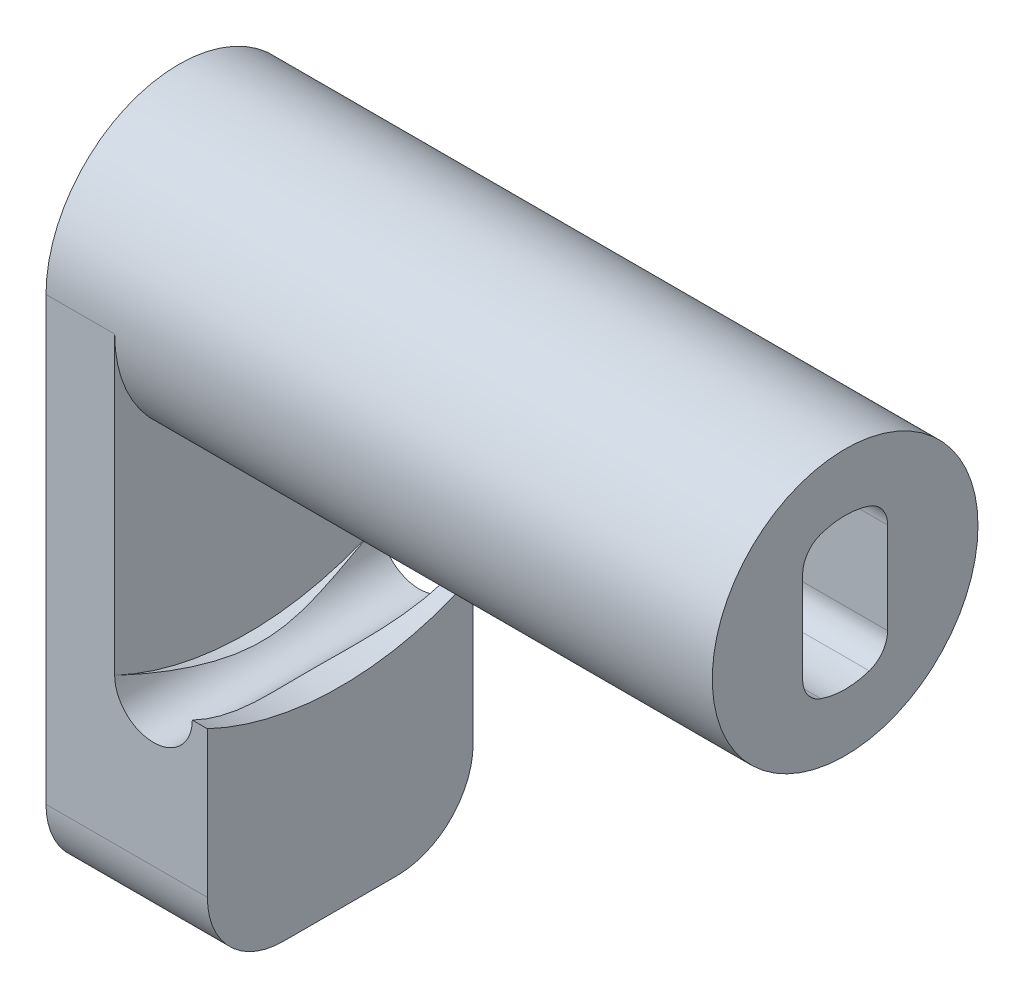
ISO-10303-21;
HEADER;
FILE_DESCRIPTION(('STEP AP214'),'2;1');
FILE_NAME('part.step','',(''),(''),'','','');
FILE_SCHEMA(('AUTOMOTIVE_DESIGN { 1 0 10303 214 1 1 1 1 }'));
ENDSEC;
DATA;
#1=APPLICATION_CONTEXT('core data for automotive mechanical design processes');
#2=APPLICATION_PROTOCOL_DEFINITION('international standard','automotive_design',2000,#1);
#3=PRODUCT_CONTEXT('',#1,'mechanical');
#4=PRODUCT('Part','Part','',(#3));
#5=PRODUCT_RELATED_PRODUCT_CATEGORY('part','',(#4));
#6=PRODUCT_DEFINITION_FORMATION('','',#4);
#7=PRODUCT_DEFINITION_CONTEXT('part definition',#1,'design');
#8=PRODUCT_DEFINITION('design','',#6,#7);
#9=PRODUCT_DEFINITION_SHAPE('','',#8);
#10=(LENGTH_UNIT() NAMED_UNIT(*) SI_UNIT(.MILLI.,.METRE.));
#11=(NAMED_UNIT(*) PLANE_ANGLE_UNIT() SI_UNIT($,.RADIAN.));
#12=(NAMED_UNIT(*) SI_UNIT($,.STERADIAN.) SOLID_ANGLE_UNIT());
#13=UNCERTAINTY_MEASURE_WITH_UNIT(LENGTH_MEASURE(1.E-05),#10,'distance_accuracy_value','');
#14=(GEOMETRIC_REPRESENTATION_CONTEXT(3) GLOBAL_UNCERTAINTY_ASSIGNED_CONTEXT((#13)) GLOBAL_UNIT_ASSIGNED_CONTEXT((#10,
#11,#12)) REPRESENTATION_CONTEXT('',''));
#15=CARTESIAN_POINT('',(0.,0.,0.));
#16=DIRECTION('',(0.,0.,1.));
#17=DIRECTION('',(1.,0.,0.));
#18=AXIS2_PLACEMENT_3D('',#15,#16,#17);
#19=CARTESIAN_POINT('',(-13.1529612058234,-1.08551700717587,0.));
#20=DIRECTION('',(1.,0.,0.));
#21=DIRECTION('',(0.,0.,-1.));
#22=AXIS2_PLACEMENT_3D('',#19,#20,#21);
#23=CYLINDRICAL_SURFACE('',#22,20.32);
#24=CARTESIAN_POINT('',(4.516000112,-19.431,-8.7376));
#25=CARTESIAN_POINT('',(4.51603731749877,-19.5177287528389,-8.5555150718596));
#26=CARTESIAN_POINT('',(4.52041756207572,-19.6017131843481,-8.37218776939642));
#27=CARTESIAN_POINT('',(4.53649669182362,-19.7640441249381,-8.00346974642191));
#28=CARTESIAN_POINT('',(4.54819196914922,-19.8423933921093,-7.81808008733202));
#29=CARTESIAN_POINT('',(4.57750524371221,-19.9932298337656,-7.44587482763609));
#30=CARTESIAN_POINT('',(4.59511059020355,-20.0657291226541,-7.25906309881219));
#31=CARTESIAN_POINT('',(4.6350984527638,-20.2050234726588,-6.88381652494582));
#32=CARTESIAN_POINT('',(4.65748161048571,-20.2718177659139,-6.69538146515752));
#33=CARTESIAN_POINT('',(4.73063386302325,-20.4648184988648,-6.12434180645761));
#34=CARTESIAN_POINT('',(4.78709294470231,-20.5822383370678,-5.73947026967527));
#35=CARTESIAN_POINT('',(4.90685418840569,-20.7938885012978,-4.9642812598655));
#36=CARTESIAN_POINT('',(4.97016061356254,-20.8881042595447,-4.57396052741235));
#37=CARTESIAN_POINT('',(5.09296430268536,-21.0504853530193,-3.80167743454365));
#38=CARTESIAN_POINT('',(5.15251770203577,-21.1194348094891,-3.41988894288582));
#39=CARTESIAN_POINT('',(5.26139557184988,-21.235522973599,-2.65150880361196));
#40=CARTESIAN_POINT('',(5.31072214253996,-21.2826661619228,-2.26491815950602));
#41=CARTESIAN_POINT('',(5.36996981115032,-21.3365954064752,-1.68338288453226));
#42=CARTESIAN_POINT('',(5.38722709898677,-21.3517501970454,-1.48994178039054));
#43=CARTESIAN_POINT('',(5.41595618999079,-21.376527934953,-1.10226762126502));
#44=CARTESIAN_POINT('',(5.42742814364184,-21.3861510261775,-0.908034587012759));
#45=CARTESIAN_POINT('',(5.44384213927347,-21.399814361787,-0.519182820192744));
#46=CARTESIAN_POINT('',(5.4487872492382,-21.4038572292324,-0.324564311936539));
#47=CARTESIAN_POINT('',(5.45182482094318,-21.4063463641171,0.0647645243224691));
#48=CARTESIAN_POINT('',(5.44991713093645,-21.4047925076236,0.25947485426309));
#49=CARTESIAN_POINT('',(5.43791560220297,-21.3949008098425,0.702031122744907));
#50=CARTESIAN_POINT('',(5.42571740508307,-21.3848170128464,0.949783737628716));
#51=CARTESIAN_POINT('',(5.39165308592273,-21.3556506908518,1.44409389752363));
#52=CARTESIAN_POINT('',(5.36978570537389,-21.3365669944351,1.69065128274307));
#53=CARTESIAN_POINT('',(5.31841361275851,-21.2894896279478,2.1824283587983));
#54=CARTESIAN_POINT('',(5.28889873312364,-21.2614840845627,2.42764582157201));
#55=CARTESIAN_POINT('',(5.22459428249614,-21.1966813330368,2.91619580195046));
#56=CARTESIAN_POINT('',(5.18980480135659,-21.1598842746537,3.15952835159059));
#57=CARTESIAN_POINT('',(5.11704832924566,-21.0773221209748,3.64572203666351));
#58=CARTESIAN_POINT('',(5.0790635160548,-21.03150451255,3.88857157186214));
#59=CARTESIAN_POINT('',(5.00229123413209,-20.931076768087,4.37232221506012));
#60=CARTESIAN_POINT('',(4.96350366591518,-20.876465536504,4.61322307635335));
#61=CARTESIAN_POINT('',(4.84906519895848,-20.6995446264881,5.332540827966));
#62=CARTESIAN_POINT('',(4.77524179271125,-20.5640491428703,5.80815334623814));
#63=CARTESIAN_POINT('',(4.68332294902369,-20.3429656895821,6.48856420455001));
#64=CARTESIAN_POINT('',(4.6570609963979,-20.2715032996002,6.69693796652465));
#65=CARTESIAN_POINT('',(4.60994604418476,-20.1216333367819,7.1117720077411));
#66=CARTESIAN_POINT('',(4.58909206679276,-20.0432270229058,7.31823262637574));
#67=CARTESIAN_POINT('',(4.55437450524215,-19.8797799982117,7.72829969041081));
#68=CARTESIAN_POINT('',(4.5404869822015,-19.7947631829191,7.93191353995666));
#69=CARTESIAN_POINT('',(4.52609874323223,-19.6621542658722,8.23548148381315));
#70=CARTESIAN_POINT('',(4.52237634337057,-19.617088565154,8.33639443081653));
#71=CARTESIAN_POINT('',(4.51732854253573,-19.525288679427,8.53753160177582));
#72=CARTESIAN_POINT('',(4.51600340983757,-19.4785543082763,8.63775574739877));
#73=CARTESIAN_POINT('',(4.516000112,-19.431,8.7376));
#74=B_SPLINE_CURVE_WITH_KNOTS('',3,(#24,#25,#26,#27,#28,#29,#30,#31,#32,#33,#34,#35,#36,#37,#38,
#39,#40,#41,#42,#43,#44,#45,#46,#47,#48,#49,#50,#51,#52,#53,#54,#55,#56,#57,#58,#59,#60,#61,#62,
#63,#64,#65,#66,#67,#68,#69,#70,#71,#72,#73),.UNSPECIFIED.,.F.,.F.,(4,2,2,2,2,2,2,2,2,2,2,2,2,2,
2,2,2,2,2,2,2,2,2,2,4),(0.,0.604902094843688,1.20950608108938,1.81282405341211,2.41622310148412,
3.6342575228127,4.8530547015255,6.02995777472376,7.20661891401831,7.79087980929366,
8.37512550645878,8.95909647731702,9.54308037958888,10.2874501190093,11.0319167716234,
11.7773783385945,12.522827208021,13.2727513586984,14.0227690103302,15.5210179611022,
16.1864245199329,16.8517106839849,17.5146947852316,17.8464021322582,18.1781465979217),.UNSPECIFIED.);
#75=CARTESIAN_POINT('',(4.516000112,-19.431,-8.7376));
#76=VERTEX_POINT('',#75);
#77=CARTESIAN_POINT('',(4.516000112,-19.431,8.7376));
#78=VERTEX_POINT('',#77);
#79=EDGE_CURVE('E225',#76,#78,#74,.T.);
#80=ORIENTED_EDGE('',*,*,#79,.F.);
#81=CARTESIAN_POINT('',(4.516000112,-1.08551700717587,0.));
#82=DIRECTION('',(-1.,0.,0.));
#83=DIRECTION('',(0.,0.,1.));
#84=AXIS2_PLACEMENT_3D('',#81,#82,#83);
#85=CIRCLE('',#84,20.32);
#86=EDGE_CURVE('E243',#76,#78,#85,.T.);
#87=ORIENTED_EDGE('',*,*,#86,.T.);
#88=EDGE_LOOP('',(#80,#87));
#89=FACE_BOUND('',#88,.T.);
#90=ADVANCED_FACE('F46',(#89),#23,.F.);
#91=CARTESIAN_POINT('',(43.815,0.,0.));
#92=DIRECTION('',(-1.,0.,0.));
#93=DIRECTION('',(0.,0.,1.));
#94=AXIS2_PLACEMENT_3D('',#91,#92,#93);
#95=CYLINDRICAL_SURFACE('',#94,8.7376);
#96=CARTESIAN_POINT('',(4.516000112,0.,0.));
#97=DIRECTION('',(-1.,0.,0.));
#98=DIRECTION('',(0.,0.,1.));
#99=AXIS2_PLACEMENT_3D('',#96,#97,#98);
#100=CIRCLE('',#99,8.7376);
#101=CARTESIAN_POINT('',(4.516000112,0.,-8.7376));
#102=VERTEX_POINT('',#101);
#103=CARTESIAN_POINT('',(4.516000112,0.,8.7376));
#104=VERTEX_POINT('',#103);
#105=EDGE_CURVE('E266',#102,#104,#100,.T.);
#106=ORIENTED_EDGE('',*,*,#105,.F.);
#107=DIRECTION('',(-1.,0.,0.));
#108=VECTOR('',#107,1.);
#109=CARTESIAN_POINT('',(4.516000112,0.,-8.7376));
#110=LINE('',#109,#108);
#111=CARTESIAN_POINT('',(0.,0.,-8.7376));
#112=VERTEX_POINT('',#111);
#113=EDGE_CURVE('E276',#102,#112,#110,.T.);
#114=ORIENTED_EDGE('',*,*,#113,.T.);
#115=CARTESIAN_POINT('',(0.,0.,0.));
#116=DIRECTION('',(1.,0.,0.));
#117=DIRECTION('',(0.,0.,-1.));
#118=AXIS2_PLACEMENT_3D('',#115,#116,#117);
#119=CIRCLE('',#118,8.7376);
#120=CARTESIAN_POINT('',(0.,0.,8.7376));
#121=VERTEX_POINT('',#120);
#122=EDGE_CURVE('E278',#112,#121,#119,.T.);
#123=ORIENTED_EDGE('',*,*,#122,.T.);
#124=DIRECTION('',(-1.,0.,0.));
#125=VECTOR('',#124,1.);
#126=CARTESIAN_POINT('',(4.516000112,0.,8.7376));
#127=LINE('',#126,#125);
#128=EDGE_CURVE('E267',#104,#121,#127,.T.);
#129=ORIENTED_EDGE('',*,*,#128,.F.);
#130=EDGE_LOOP('',(#106,#114,#123,#129));
#131=FACE_BOUND('',#130,.T.);
#132=CARTESIAN_POINT('',(43.815,0.,0.));
#133=DIRECTION('',(1.,0.,0.));
#134=DIRECTION('',(0.,0.,-1.));
#135=AXIS2_PLACEMENT_3D('',#132,#133,#134);
#136=CIRCLE('',#135,8.7376);
#137=CARTESIAN_POINT('',(43.815,0.,-8.7376));
#138=VERTEX_POINT('',#137);
#139=EDGE_CURVE('E285',#138,#138,#136,.T.);
#140=ORIENTED_EDGE('',*,*,#139,.F.);
#141=EDGE_LOOP('',(#140));
#142=FACE_BOUND('',#141,.T.);
#143=ADVANCED_FACE('F384',(#131,#142),#95,.T.);
#144=CARTESIAN_POINT('',(43.815,0.,0.));
#145=DIRECTION('',(1.,0.,0.));
#146=DIRECTION('',(0.,0.,-1.));
#147=AXIS2_PLACEMENT_3D('',#144,#145,#146);
#148=PLANE('',#147);
#149=CARTESIAN_POINT('',(43.815,0.,0.));
#150=DIRECTION('',(1.,0.,0.));
#151=DIRECTION('',(0.,0.,-1.));
#152=AXIS2_PLACEMENT_3D('',#149,#150,#151);
#153=CIRCLE('',#152,4.953);
#154=CARTESIAN_POINT('',(43.815,4.69255908842926,-1.58496));
#155=VERTEX_POINT('',#154);
#156=CARTESIAN_POINT('',(43.815,4.69255908842926,1.58496));
#157=VERTEX_POINT('',#156);
#158=EDGE_CURVE('E468',#155,#157,#153,.T.);
#159=ORIENTED_EDGE('',*,*,#158,.F.);
#160=CARTESIAN_POINT('',(43.815,3.00805069771106,-1.016));
#161=DIRECTION('',(1.,0.,0.));
#162=DIRECTION('',(0.,0.,-1.));
#163=AXIS2_PLACEMENT_3D('',#160,#161,#162);
#164=CIRCLE('',#163,1.778);
#165=CARTESIAN_POINT('',(43.815,3.00805069771106,-2.794));
#166=VERTEX_POINT('',#165);
#167=EDGE_CURVE('E330',#155,#166,#164,.F.);
#168=ORIENTED_EDGE('',*,*,#167,.T.);
#169=DIRECTION('',(0.,1.,0.));
#170=VECTOR('',#169,1.);
#171=CARTESIAN_POINT('',(43.815,-4.08971551577857,-2.794));
#172=LINE('',#171,#170);
#173=CARTESIAN_POINT('',(43.815,-3.00805069771106,-2.794));
#174=VERTEX_POINT('',#173);
#175=EDGE_CURVE('E474',#174,#166,#172,.T.);
#176=ORIENTED_EDGE('',*,*,#175,.F.);
#177=CARTESIAN_POINT('',(43.815,-3.00805069771106,-1.016));
#178=DIRECTION('',(1.,0.,0.));
#179=DIRECTION('',(0.,0.,-1.));
#180=AXIS2_PLACEMENT_3D('',#177,#178,#179);
#181=CIRCLE('',#180,1.778);
#182=CARTESIAN_POINT('',(43.815,-4.69255908842926,-1.58496));
#183=VERTEX_POINT('',#182);
#184=EDGE_CURVE('E331',#174,#183,#181,.F.);
#185=ORIENTED_EDGE('',*,*,#184,.T.);
#186=CARTESIAN_POINT('',(43.815,0.,0.));
#187=DIRECTION('',(1.,0.,0.));
#188=DIRECTION('',(0.,0.,-1.));
#189=AXIS2_PLACEMENT_3D('',#186,#187,#188);
#190=CIRCLE('',#189,4.953);
#191=CARTESIAN_POINT('',(43.815,-4.69255908842926,1.58496));
#192=VERTEX_POINT('',#191);
#193=EDGE_CURVE('E489',#192,#183,#190,.T.);
#194=ORIENTED_EDGE('',*,*,#193,.F.);
#195=CARTESIAN_POINT('',(43.815,-3.00805069771106,1.016));
#196=DIRECTION('',(1.,0.,0.));
#197=DIRECTION('',(0.,0.,-1.));
#198=AXIS2_PLACEMENT_3D('',#195,#196,#197);
#199=CIRCLE('',#198,1.778);
#200=CARTESIAN_POINT('',(43.815,-3.00805069771106,2.794));
#201=VERTEX_POINT('',#200);
#202=EDGE_CURVE('E223',#192,#201,#199,.F.);
#203=ORIENTED_EDGE('',*,*,#202,.T.);
#204=DIRECTION('',(0.,-1.,0.));
#205=VECTOR('',#204,1.);
#206=CARTESIAN_POINT('',(43.815,-4.08971551577857,2.794));
#207=LINE('',#206,#205);
#208=CARTESIAN_POINT('',(43.815,3.00805069771106,2.794));
#209=VERTEX_POINT('',#208);
#210=EDGE_CURVE('E488',#209,#201,#207,.T.);
#211=ORIENTED_EDGE('',*,*,#210,.F.);
#212=CARTESIAN_POINT('',(43.815,3.00805069771106,1.016));
#213=DIRECTION('',(1.,0.,0.));
#214=DIRECTION('',(0.,0.,-1.));
#215=AXIS2_PLACEMENT_3D('',#212,#213,#214);
#216=CIRCLE('',#215,1.778);
#217=EDGE_CURVE('E333',#209,#157,#216,.F.);
#218=ORIENTED_EDGE('',*,*,#217,.T.);
#219=EDGE_LOOP('',(#159,#168,#176,#185,#194,#203,#211,#218));
#220=FACE_BOUND('',#219,.T.);
#221=ORIENTED_EDGE('',*,*,#139,.T.);
#222=EDGE_LOOP('',(#221));
#223=FACE_BOUND('',#222,.T.);
#224=ADVANCED_FACE('F391',(#220,#223),#148,.T.);
#225=CARTESIAN_POINT('',(0.,0.,0.));
#226=DIRECTION('',(1.,0.,0.));
#227=DIRECTION('',(0.,0.,-1.));
#228=AXIS2_PLACEMENT_3D('',#225,#226,#227);
#229=PLANE('',#228);
#230=CARTESIAN_POINT('',(0.,0.,0.));
#231=DIRECTION('',(-1.,0.,0.));
#232=DIRECTION('',(0.,0.,1.));
#233=AXIS2_PLACEMENT_3D('',#230,#231,#232);
#234=CIRCLE('',#233,4.064);
#235=CARTESIAN_POINT('',(0.,-3.29817815590477,2.37447191011236));
#236=VERTEX_POINT('',#235);
#237=CARTESIAN_POINT('',(0.,-3.29817815590477,-2.37447191011236));
#238=VERTEX_POINT('',#237);
#239=EDGE_CURVE('E463',#236,#238,#234,.T.);
#240=ORIENTED_EDGE('',*,*,#239,.F.);
#241=CARTESIAN_POINT('',(0.,-4.58652899805506,3.302));
#242=DIRECTION('',(1.,0.,0.));
#243=DIRECTION('',(0.,0.,-1.));
#244=AXIS2_PLACEMENT_3D('',#241,#242,#243);
#245=CIRCLE('',#244,1.5875);
#246=CARTESIAN_POINT('',(0.,-4.58652899805506,1.7145));
#247=VERTEX_POINT('',#246);
#248=EDGE_CURVE('E408',#236,#247,#245,.F.);
#249=ORIENTED_EDGE('',*,*,#248,.T.);
#250=DIRECTION('',(0.,1.,0.));
#251=VECTOR('',#250,1.);
#252=CARTESIAN_POINT('',(0.,-3.68464187540662,1.7145));
#253=LINE('',#252,#251);
#254=CARTESIAN_POINT('',(0.,-5.58964187540662,1.7145));
#255=VERTEX_POINT('',#254);
#256=EDGE_CURVE('E437',#255,#247,#253,.T.);
#257=ORIENTED_EDGE('',*,*,#256,.F.);
#258=CARTESIAN_POINT('',(0.,-5.58964187540662,0.127));
#259=DIRECTION('',(1.,0.,0.));
#260=DIRECTION('',(0.,0.,-1.));
#261=AXIS2_PLACEMENT_3D('',#258,#259,#260);
#262=CIRCLE('',#261,1.5875);
#263=CARTESIAN_POINT('',(0.,-7.17714187540662,0.127));
#264=VERTEX_POINT('',#263);
#265=EDGE_CURVE('E427',#255,#264,#262,.T.);
#266=ORIENTED_EDGE('',*,*,#265,.T.);
#267=DIRECTION('',(0.,0.,1.));
#268=VECTOR('',#267,1.);
#269=CARTESIAN_POINT('',(0.,-7.17714187540662,1.7145));
#270=LINE('',#269,#268);
#271=CARTESIAN_POINT('',(0.,-7.17714187540662,-0.127000000000001));
#272=VERTEX_POINT('',#271);
#273=EDGE_CURVE('E436',#272,#264,#270,.T.);
#274=ORIENTED_EDGE('',*,*,#273,.F.);
#275=CARTESIAN_POINT('',(0.,-5.58964187540662,-0.127));
#276=DIRECTION('',(1.,0.,0.));
#277=DIRECTION('',(0.,0.,-1.));
#278=AXIS2_PLACEMENT_3D('',#275,#276,#277);
#279=CIRCLE('',#278,1.5875);
#280=CARTESIAN_POINT('',(0.,-5.58964187540662,-1.7145));
#281=VERTEX_POINT('',#280);
#282=EDGE_CURVE('E12',#272,#281,#279,.T.);
#283=ORIENTED_EDGE('',*,*,#282,.T.);
#284=DIRECTION('',(0.,-1.,0.));
#285=VECTOR('',#284,1.);
#286=CARTESIAN_POINT('',(0.,-3.68464187540662,-1.7145));
#287=LINE('',#286,#285);
#288=CARTESIAN_POINT('',(0.,-4.58652899805507,-1.7145));
#289=VERTEX_POINT('',#288);
#290=EDGE_CURVE('E450',#289,#281,#287,.T.);
#291=ORIENTED_EDGE('',*,*,#290,.F.);
#292=CARTESIAN_POINT('',(0.,-4.58652899805507,-3.302));
#293=DIRECTION('',(1.,0.,0.));
#294=DIRECTION('',(0.,0.,-1.));
#295=AXIS2_PLACEMENT_3D('',#292,#293,#294);
#296=CIRCLE('',#295,1.5875);
#297=EDGE_CURVE('E404',#289,#238,#296,.F.);
#298=ORIENTED_EDGE('',*,*,#297,.T.);
#299=EDGE_LOOP('',(#240,#249,#257,#266,#274,#283,#291,#298));
#300=FACE_BOUND('',#299,.T.);
#301=DIRECTION('',(0.,0.,-1.));
#302=VECTOR('',#301,1.);
#303=CARTESIAN_POINT('',(0.,-34.036,0.));
#304=LINE('',#303,#302);
#305=CARTESIAN_POINT('',(0.,-34.036,3.7376));
#306=VERTEX_POINT('',#305);
#307=CARTESIAN_POINT('',(0.,-34.036,-3.7376));
#308=VERTEX_POINT('',#307);
#309=EDGE_CURVE('E271',#306,#308,#304,.T.);
#310=ORIENTED_EDGE('',*,*,#309,.F.);
#311=CARTESIAN_POINT('',(0.,-29.036,3.7376));
#312=DIRECTION('',(1.,0.,0.));
#313=DIRECTION('',(0.,0.,-1.));
#314=AXIS2_PLACEMENT_3D('',#311,#312,#313);
#315=CIRCLE('',#314,5.);
#316=CARTESIAN_POINT('',(0.,-29.036,8.7376));
#317=VERTEX_POINT('',#316);
#318=EDGE_CURVE('E292',#306,#317,#315,.F.);
#319=ORIENTED_EDGE('',*,*,#318,.T.);
#320=DIRECTION('',(0.,-1.,0.));
#321=VECTOR('',#320,1.);
#322=CARTESIAN_POINT('',(0.,0.,8.7376));
#323=LINE('',#322,#321);
#324=EDGE_CURVE('E261',#121,#317,#323,.T.);
#325=ORIENTED_EDGE('',*,*,#324,.F.);
#326=ORIENTED_EDGE('',*,*,#122,.F.);
#327=DIRECTION('',(0.,1.,0.));
#328=VECTOR('',#327,1.);
#329=CARTESIAN_POINT('',(0.,0.,-8.7376));
#330=LINE('',#329,#328);
#331=CARTESIAN_POINT('',(0.,-29.036,-8.7376));
#332=VERTEX_POINT('',#331);
#333=EDGE_CURVE('E259',#332,#112,#330,.T.);
#334=ORIENTED_EDGE('',*,*,#333,.F.);
#335=CARTESIAN_POINT('',(0.,-29.036,-3.7376));
#336=DIRECTION('',(1.,0.,0.));
#337=DIRECTION('',(0.,0.,-1.));
#338=AXIS2_PLACEMENT_3D('',#335,#336,#337);
#339=CIRCLE('',#338,5.);
#340=EDGE_CURVE('E291',#332,#308,#339,.F.);
#341=ORIENTED_EDGE('',*,*,#340,.T.);
#342=EDGE_LOOP('',(#310,#319,#325,#326,#334,#341));
#343=FACE_BOUND('',#342,.T.);
#344=ADVANCED_FACE('F431',(#300,#343),#229,.F.);
#345=CARTESIAN_POINT('',(4.516000112,0.,-8.7376));
#346=DIRECTION('',(0.,0.,1.));
#347=DIRECTION('',(0.,-1.,0.));
#348=AXIS2_PLACEMENT_3D('',#345,#346,#347);
#349=PLANE('',#348);
#350=DIRECTION('',(0.,1.,0.));
#351=VECTOR('',#350,1.);
#352=CARTESIAN_POINT('',(4.516000112,0.,-8.7376));
#353=LINE('',#352,#351);
#354=EDGE_CURVE('E235',#76,#102,#353,.T.);
#355=ORIENTED_EDGE('',*,*,#354,.F.);
#356=CARTESIAN_POINT('',(7.068700112,-19.431,-8.7376));
#357=DIRECTION('',(0.,0.,-1.));
#358=DIRECTION('',(0.,1.,0.));
#359=AXIS2_PLACEMENT_3D('',#356,#357,#358);
#360=CIRCLE('',#359,2.5527);
#361=CARTESIAN_POINT('',(9.621400112,-19.431,-8.7376));
#362=VERTEX_POINT('',#361);
#363=EDGE_CURVE('E214',#362,#76,#360,.T.);
#364=ORIENTED_EDGE('',*,*,#363,.F.);
#365=DIRECTION('',(1.,0.,0.));
#366=VECTOR('',#365,1.);
#367=CARTESIAN_POINT('',(-13.1529612058234,-19.431,-8.7376));
#368=LINE('',#367,#366);
#369=CARTESIAN_POINT('',(10.612000112,-19.431,-8.7376));
#370=VERTEX_POINT('',#369);
#371=EDGE_CURVE('E230',#362,#370,#368,.T.);
#372=ORIENTED_EDGE('',*,*,#371,.T.);
#373=DIRECTION('',(0.,1.,0.));
#374=VECTOR('',#373,1.);
#375=CARTESIAN_POINT('',(10.612000112,0.,-8.7376));
#376=LINE('',#375,#374);
#377=CARTESIAN_POINT('',(10.612000112,-29.036,-8.7376));
#378=VERTEX_POINT('',#377);
#379=EDGE_CURVE('E256',#378,#370,#376,.T.);
#380=ORIENTED_EDGE('',*,*,#379,.F.);
#381=DIRECTION('',(-1.,0.,0.));
#382=VECTOR('',#381,1.);
#383=CARTESIAN_POINT('',(4.516000112,-29.036,-8.7376));
#384=LINE('',#383,#382);
#385=EDGE_CURVE('E298',#378,#332,#384,.T.);
#386=ORIENTED_EDGE('',*,*,#385,.T.);
#387=ORIENTED_EDGE('',*,*,#333,.T.);
#388=ORIENTED_EDGE('',*,*,#113,.F.);
#389=EDGE_LOOP('',(#355,#364,#372,#380,#386,#387,#388));
#390=FACE_BOUND('',#389,.T.);
#391=ADVANCED_FACE('F229',(#390),#349,.F.);
#392=CARTESIAN_POINT('',(4.516000112,0.,8.7376));
#393=DIRECTION('',(0.,0.,-1.));
#394=DIRECTION('',(0.,1.,0.));
#395=AXIS2_PLACEMENT_3D('',#392,#393,#394);
#396=PLANE('',#395);
#397=DIRECTION('',(1.,0.,0.));
#398=VECTOR('',#397,1.);
#399=CARTESIAN_POINT('',(-13.1529612058234,-19.431,8.7376));
#400=LINE('',#399,#398);
#401=CARTESIAN_POINT('',(9.621400112,-19.431,8.7376));
#402=VERTEX_POINT('',#401);
#403=CARTESIAN_POINT('',(10.612000112,-19.431,8.7376));
#404=VERTEX_POINT('',#403);
#405=EDGE_CURVE('E239',#402,#404,#400,.T.);
#406=ORIENTED_EDGE('',*,*,#405,.F.);
#407=CARTESIAN_POINT('',(7.068700112,-19.431,8.7376));
#408=DIRECTION('',(0.,0.,-1.));
#409=DIRECTION('',(0.,1.,0.));
#410=AXIS2_PLACEMENT_3D('',#407,#408,#409);
#411=CIRCLE('',#410,2.5527);
#412=EDGE_CURVE('E217',#402,#78,#411,.T.);
#413=ORIENTED_EDGE('',*,*,#412,.T.);
#414=DIRECTION('',(0.,-1.,0.));
#415=VECTOR('',#414,1.);
#416=CARTESIAN_POINT('',(4.516000112,0.,8.7376));
#417=LINE('',#416,#415);
#418=EDGE_CURVE('E265',#104,#78,#417,.T.);
#419=ORIENTED_EDGE('',*,*,#418,.F.);
#420=ORIENTED_EDGE('',*,*,#128,.T.);
#421=ORIENTED_EDGE('',*,*,#324,.T.);
#422=DIRECTION('',(-1.,0.,0.));
#423=VECTOR('',#422,1.);
#424=CARTESIAN_POINT('',(4.516000112,-29.036,8.7376));
#425=LINE('',#424,#423);
#426=CARTESIAN_POINT('',(10.612000112,-29.036,8.7376));
#427=VERTEX_POINT('',#426);
#428=EDGE_CURVE('E294',#317,#427,#425,.F.);
#429=ORIENTED_EDGE('',*,*,#428,.T.);
#430=DIRECTION('',(0.,-1.,0.));
#431=VECTOR('',#430,1.);
#432=CARTESIAN_POINT('',(10.612000112,0.,8.7376));
#433=LINE('',#432,#431);
#434=EDGE_CURVE('E245',#404,#427,#433,.T.);
#435=ORIENTED_EDGE('',*,*,#434,.F.);
#436=EDGE_LOOP('',(#406,#413,#419,#420,#421,#429,#435));
#437=FACE_BOUND('',#436,.T.);
#438=ADVANCED_FACE('F720',(#437),#396,.F.);
#439=CARTESIAN_POINT('',(4.516000112,-34.036,0.));
#440=DIRECTION('',(0.,1.,0.));
#441=DIRECTION('',(0.,0.,1.));
#442=AXIS2_PLACEMENT_3D('',#439,#440,#441);
#443=PLANE('',#442);
#444=DIRECTION('',(-1.,0.,0.));
#445=VECTOR('',#444,1.);
#446=CARTESIAN_POINT('',(4.516000112,-34.036,-3.7376));
#447=LINE('',#446,#445);
#448=CARTESIAN_POINT('',(10.612000112,-34.036,-3.7376));
#449=VERTEX_POINT('',#448);
#450=EDGE_CURVE('E283',#308,#449,#447,.F.);
#451=ORIENTED_EDGE('',*,*,#450,.T.);
#452=DIRECTION('',(0.,0.,-1.));
#453=VECTOR('',#452,1.);
#454=CARTESIAN_POINT('',(10.612000112,-34.036,0.));
#455=LINE('',#454,#453);
#456=CARTESIAN_POINT('',(10.612000112,-34.036,3.7376));
#457=VERTEX_POINT('',#456);
#458=EDGE_CURVE('E254',#457,#449,#455,.T.);
#459=ORIENTED_EDGE('',*,*,#458,.F.);
#460=DIRECTION('',(-1.,0.,0.));
#461=VECTOR('',#460,1.);
#462=CARTESIAN_POINT('',(4.516000112,-34.036,3.7376));
#463=LINE('',#462,#461);
#464=EDGE_CURVE('E287',#457,#306,#463,.T.);
#465=ORIENTED_EDGE('',*,*,#464,.T.);
#466=ORIENTED_EDGE('',*,*,#309,.T.);
#467=EDGE_LOOP('',(#451,#459,#465,#466));
#468=FACE_BOUND('',#467,.T.);
#469=ADVANCED_FACE('F706',(#468),#443,.F.);
#470=CARTESIAN_POINT('',(4.516000112,0.,0.));
#471=DIRECTION('',(-1.,0.,0.));
#472=DIRECTION('',(0.,0.,1.));
#473=AXIS2_PLACEMENT_3D('',#470,#471,#472);
#474=PLANE('',#473);
#475=ORIENTED_EDGE('',*,*,#418,.T.);
#476=ORIENTED_EDGE('',*,*,#86,.F.);
#477=ORIENTED_EDGE('',*,*,#354,.T.);
#478=ORIENTED_EDGE('',*,*,#105,.T.);
#479=EDGE_LOOP('',(#475,#476,#477,#478));
#480=FACE_BOUND('',#479,.T.);
#481=ADVANCED_FACE('F533',(#480),#474,.F.);
#482=CARTESIAN_POINT('',(4.516000112,-29.036,3.7376));
#483=DIRECTION('',(-1.,0.,0.));
#484=DIRECTION('',(0.,0.,1.));
#485=AXIS2_PLACEMENT_3D('',#482,#483,#484);
#486=CYLINDRICAL_SURFACE('',#485,5.);
#487=ORIENTED_EDGE('',*,*,#464,.F.);
#488=CARTESIAN_POINT('',(10.612000112,-29.036,3.7376));
#489=DIRECTION('',(1.,0.,0.));
#490=DIRECTION('',(0.,0.,-1.));
#491=AXIS2_PLACEMENT_3D('',#488,#489,#490);
#492=CIRCLE('',#491,5.);
#493=EDGE_CURVE('E247',#427,#457,#492,.T.);
#494=ORIENTED_EDGE('',*,*,#493,.F.);
#495=ORIENTED_EDGE('',*,*,#428,.F.);
#496=ORIENTED_EDGE('',*,*,#318,.F.);
#497=EDGE_LOOP('',(#487,#494,#495,#496));
#498=FACE_BOUND('',#497,.T.);
#499=ADVANCED_FACE('F532',(#498),#486,.T.);
#500=CARTESIAN_POINT('',(4.516000112,-29.036,-3.7376));
#501=DIRECTION('',(-1.,0.,0.));
#502=DIRECTION('',(0.,0.,1.));
#503=AXIS2_PLACEMENT_3D('',#500,#501,#502);
#504=CYLINDRICAL_SURFACE('',#503,5.);
#505=ORIENTED_EDGE('',*,*,#385,.F.);
#506=CARTESIAN_POINT('',(10.612000112,-29.036,-3.7376));
#507=DIRECTION('',(1.,0.,0.));
#508=DIRECTION('',(0.,0.,-1.));
#509=AXIS2_PLACEMENT_3D('',#506,#507,#508);
#510=CIRCLE('',#509,5.);
#511=EDGE_CURVE('E251',#449,#378,#510,.T.);
#512=ORIENTED_EDGE('',*,*,#511,.F.);
#513=ORIENTED_EDGE('',*,*,#450,.F.);
#514=ORIENTED_EDGE('',*,*,#340,.F.);
#515=EDGE_LOOP('',(#505,#512,#513,#514));
#516=FACE_BOUND('',#515,.T.);
#517=ADVANCED_FACE('F534',(#516),#504,.T.);
#518=CARTESIAN_POINT('',(10.612000112,0.,0.));
#519=DIRECTION('',(1.,0.,0.));
#520=DIRECTION('',(0.,0.,-1.));
#521=AXIS2_PLACEMENT_3D('',#518,#519,#520);
#522=PLANE('',#521);
#523=ORIENTED_EDGE('',*,*,#379,.T.);
#524=CARTESIAN_POINT('',(10.612000112,-1.08551700717587,0.));
#525=DIRECTION('',(1.,0.,0.));
#526=DIRECTION('',(0.,0.,-1.));
#527=AXIS2_PLACEMENT_3D('',#524,#525,#526);
#528=CIRCLE('',#527,20.32);
#529=EDGE_CURVE('E237',#370,#404,#528,.F.);
#530=ORIENTED_EDGE('',*,*,#529,.T.);
#531=ORIENTED_EDGE('',*,*,#434,.T.);
#532=ORIENTED_EDGE('',*,*,#493,.T.);
#533=ORIENTED_EDGE('',*,*,#458,.T.);
#534=ORIENTED_EDGE('',*,*,#511,.T.);
#535=EDGE_LOOP('',(#523,#530,#531,#532,#533,#534));
#536=FACE_BOUND('',#535,.T.);
#537=ADVANCED_FACE('F382',(#536),#522,.T.);
#538=CARTESIAN_POINT('',(9.621400112,-19.431,8.73760000000001));
#539=CARTESIAN_POINT('',(9.62136290650122,-19.5177287528389,8.55551507185961));
#540=CARTESIAN_POINT('',(9.61698266192428,-19.6017131843481,8.37218776939643));
#541=CARTESIAN_POINT('',(9.60090353217638,-19.7640441249381,8.00346974642192));
#542=CARTESIAN_POINT('',(9.58920825485078,-19.8423933921093,7.81808008733204));
#543=CARTESIAN_POINT('',(9.55989498028779,-19.9932298337656,7.4458748276361));
#544=CARTESIAN_POINT('',(9.54228963379645,-20.0657291226541,7.25906309881221));
#545=CARTESIAN_POINT('',(9.5023017712362,-20.2050234726588,6.88381652494584));
#546=CARTESIAN_POINT('',(9.47991861351429,-20.2718177659139,6.69538146515754));
#547=CARTESIAN_POINT('',(9.40676636097675,-20.4648184988648,6.12434180645763));
#548=CARTESIAN_POINT('',(9.35030727929769,-20.5822383370678,5.73947026967529));
#549=CARTESIAN_POINT('',(9.23054603559431,-20.7938885012978,4.96428125986553));
#550=CARTESIAN_POINT('',(9.16723961043746,-20.8881042595446,4.57396052741238));
#551=CARTESIAN_POINT('',(9.04443592131464,-21.0504853530193,3.80167743454368));
#552=CARTESIAN_POINT('',(8.98488252196424,-21.1194348094891,3.41988894288584));
#553=CARTESIAN_POINT('',(8.87600465215012,-21.235522973599,2.65150880361197));
#554=CARTESIAN_POINT('',(8.82667808146003,-21.2826661619228,2.26491815950603));
#555=CARTESIAN_POINT('',(8.76743041284968,-21.3365954064752,1.68338288453227));
#556=CARTESIAN_POINT('',(8.75017312501324,-21.3517501970454,1.48994178039055));
#557=CARTESIAN_POINT('',(8.72144403400921,-21.376527934953,1.10226762126502));
#558=CARTESIAN_POINT('',(8.70997208035815,-21.3861510261775,0.908034587012754));
#559=CARTESIAN_POINT('',(8.69355808472652,-21.399814361787,0.519182820192736));
#560=CARTESIAN_POINT('',(8.6886129747618,-21.4038572292324,0.324564311936529));
#561=CARTESIAN_POINT('',(8.68557540305681,-21.4063463641171,-0.0647645243224828));
#562=CARTESIAN_POINT('',(8.68748309306355,-21.4047925076236,-0.259474854263106));
#563=CARTESIAN_POINT('',(8.69948462179703,-21.3949008098425,-0.702031122744926));
#564=CARTESIAN_POINT('',(8.71168281891693,-21.3848170128464,-0.949783737628736));
#565=CARTESIAN_POINT('',(8.74574713807727,-21.3556506908518,-1.44409389752365));
#566=CARTESIAN_POINT('',(8.76761451862611,-21.3365669944351,-1.69065128274309));
#567=CARTESIAN_POINT('',(8.8189866112415,-21.2894896279478,-2.18242835879833));
#568=CARTESIAN_POINT('',(8.84850149087637,-21.2614840845627,-2.42764582157203));
#569=CARTESIAN_POINT('',(8.91280594150386,-21.1966813330368,-2.91619580195049));
#570=CARTESIAN_POINT('',(8.94759542264341,-21.1598842746537,-3.15952835159061));
#571=CARTESIAN_POINT('',(9.02035189475434,-21.0773221209747,-3.64572203666354));
#572=CARTESIAN_POINT('',(9.0583367079452,-21.0315045125499,-3.88857157186217));
#573=CARTESIAN_POINT('',(9.13510898986792,-20.931076768087,-4.37232221506015));
#574=CARTESIAN_POINT('',(9.17389655808482,-20.876465536504,-4.61322307635338));
#575=CARTESIAN_POINT('',(9.28833502504152,-20.6995446264881,-5.33254082796604));
#576=CARTESIAN_POINT('',(9.36215843128875,-20.5640491428703,-5.80815334623818));
#577=CARTESIAN_POINT('',(9.45407727497632,-20.3429656895821,-6.48856420455005));
#578=CARTESIAN_POINT('',(9.4803392276021,-20.2715032996002,-6.69693796652469));
#579=CARTESIAN_POINT('',(9.52745417981524,-20.1216333367819,-7.11177200774113));
#580=CARTESIAN_POINT('',(9.54830815720724,-20.0432270229058,-7.31823262637576));
#581=CARTESIAN_POINT('',(9.58302571875785,-19.8797799982117,-7.72829969041083));
#582=CARTESIAN_POINT('',(9.59691324179849,-19.7947631829191,-7.93191353995668));
#583=CARTESIAN_POINT('',(9.61130148076776,-19.6621542658722,-8.23548148381315));
#584=CARTESIAN_POINT('',(9.61502388062943,-19.617088565154,-8.33639443081653));
#585=CARTESIAN_POINT('',(9.62007168146426,-19.525288679427,-8.53753160177582));
#586=CARTESIAN_POINT('',(9.62139681416243,-19.4785543082763,-8.63775574739877));
#587=CARTESIAN_POINT('',(9.621400112,-19.431,-8.7376));
#588=B_SPLINE_CURVE_WITH_KNOTS('',3,(#538,#539,#540,#541,#542,#543,#544,#545,#546,#547,#548,
#549,#550,#551,#552,#553,#554,#555,#556,#557,#558,#559,#560,#561,#562,#563,#564,#565,#566,#567,
#568,#569,#570,#571,#572,#573,#574,#575,#576,#577,#578,#579,#580,#581,#582,#583,#584,#585,#586,
#587),.UNSPECIFIED.,.F.,.F.,(4,2,2,2,2,2,2,2,2,2,2,2,2,2,2,2,2,2,2,2,2,2,2,2,4),(0.,
0.604902094843686,1.20950608108937,1.81282405341211,2.41622310148411,3.63425752281268,
4.85305470152548,6.02995777472375,7.20661891401831,7.79087980929367,8.37512550645879,
8.95909647731704,9.5430803795889,10.2874501190093,11.0319167716235,11.7773783385945,
12.5228272080211,13.2727513586984,14.0227690103302,15.5210179611022,16.1864245199329,
16.851710683985,17.5146947852316,17.8464021322582,18.1781465979217),.UNSPECIFIED.);
#589=EDGE_CURVE('E215',#402,#362,#588,.T.);
#590=ORIENTED_EDGE('',*,*,#589,.F.);
#591=ORIENTED_EDGE('',*,*,#405,.T.);
#592=ORIENTED_EDGE('',*,*,#529,.F.);
#593=ORIENTED_EDGE('',*,*,#371,.F.);
#594=EDGE_LOOP('',(#590,#591,#592,#593));
#595=FACE_BOUND('',#594,.T.);
#596=ADVANCED_FACE('F236',(#595),#23,.F.);
#597=CARTESIAN_POINT('',(31.623,0.,0.));
#598=DIRECTION('',(1.,0.,0.));
#599=DIRECTION('',(0.,0.,-1.));
#600=AXIS2_PLACEMENT_3D('',#597,#598,#599);
#601=CYLINDRICAL_SURFACE('',#600,4.953);
#602=CARTESIAN_POINT('',(31.623,0.,0.));
#603=DIRECTION('',(1.,0.,0.));
#604=DIRECTION('',(0.,0.,-1.));
#605=AXIS2_PLACEMENT_3D('',#602,#603,#604);
#606=CIRCLE('',#605,4.953);
#607=CARTESIAN_POINT('',(31.623,4.69255908842926,-1.58496));
#608=VERTEX_POINT('',#607);
#609=CARTESIAN_POINT('',(31.623,4.69255908842926,1.58496));
#610=VERTEX_POINT('',#609);
#611=EDGE_CURVE('E471',#608,#610,#606,.T.);
#612=ORIENTED_EDGE('',*,*,#611,.F.);
#613=DIRECTION('',(1.,0.,0.));
#614=VECTOR('',#613,1.);
#615=CARTESIAN_POINT('',(31.623,4.69255908842926,-1.58496));
#616=LINE('',#615,#614);
#617=EDGE_CURVE('E302',#608,#155,#616,.T.);
#618=ORIENTED_EDGE('',*,*,#617,.T.);
#619=ORIENTED_EDGE('',*,*,#158,.T.);
#620=DIRECTION('',(1.,0.,0.));
#621=VECTOR('',#620,1.);
#622=CARTESIAN_POINT('',(31.623,4.69255908842926,1.58496));
#623=LINE('',#622,#621);
#624=EDGE_CURVE('E303',#157,#610,#623,.F.);
#625=ORIENTED_EDGE('',*,*,#624,.T.);
#626=EDGE_LOOP('',(#612,#618,#619,#625));
#627=FACE_BOUND('',#626,.T.);
#628=ADVANCED_FACE('F367',(#627),#601,.F.);
#629=CARTESIAN_POINT('',(31.623,-4.08971551577857,-2.794));
#630=DIRECTION('',(0.,0.,-1.));
#631=DIRECTION('',(-1.,0.,0.));
#632=AXIS2_PLACEMENT_3D('',#629,#630,#631);
#633=PLANE('',#632);
#634=ORIENTED_EDGE('',*,*,#175,.T.);
#635=DIRECTION('',(-1.,0.,0.));
#636=VECTOR('',#635,1.);
#637=CARTESIAN_POINT('',(31.623,3.00805069771106,-2.794));
#638=LINE('',#637,#636);
#639=CARTESIAN_POINT('',(31.623,3.00805069771106,-2.794));
#640=VERTEX_POINT('',#639);
#641=EDGE_CURVE('E309',#166,#640,#638,.T.);
#642=ORIENTED_EDGE('',*,*,#641,.T.);
#643=DIRECTION('',(0.,1.,0.));
#644=VECTOR('',#643,1.);
#645=CARTESIAN_POINT('',(31.623,-4.08971551577857,-2.794));
#646=LINE('',#645,#644);
#647=CARTESIAN_POINT('',(31.623,-3.00805069771106,-2.794));
#648=VERTEX_POINT('',#647);
#649=EDGE_CURVE('E483',#648,#640,#646,.T.);
#650=ORIENTED_EDGE('',*,*,#649,.F.);
#651=DIRECTION('',(-1.,0.,0.));
#652=VECTOR('',#651,1.);
#653=CARTESIAN_POINT('',(43.815,-3.00805069771106,-2.794));
#654=LINE('',#653,#652);
#655=EDGE_CURVE('E307',#648,#174,#654,.F.);
#656=ORIENTED_EDGE('',*,*,#655,.T.);
#657=EDGE_LOOP('',(#634,#642,#650,#656));
#658=FACE_BOUND('',#657,.T.);
#659=ADVANCED_FACE('F363',(#658),#633,.F.);
#660=CARTESIAN_POINT('',(31.623,0.,0.));
#661=DIRECTION('',(1.,0.,0.));
#662=DIRECTION('',(0.,0.,-1.));
#663=AXIS2_PLACEMENT_3D('',#660,#661,#662);
#664=CYLINDRICAL_SURFACE('',#663,4.953);
#665=ORIENTED_EDGE('',*,*,#193,.T.);
#666=DIRECTION('',(1.,0.,0.));
#667=VECTOR('',#666,1.);
#668=CARTESIAN_POINT('',(31.623,-4.69255908842926,-1.58496));
#669=LINE('',#668,#667);
#670=CARTESIAN_POINT('',(31.623,-4.69255908842926,-1.58496));
#671=VERTEX_POINT('',#670);
#672=EDGE_CURVE('E329',#183,#671,#669,.F.);
#673=ORIENTED_EDGE('',*,*,#672,.T.);
#674=CARTESIAN_POINT('',(31.623,0.,0.));
#675=DIRECTION('',(1.,0.,0.));
#676=DIRECTION('',(0.,0.,-1.));
#677=AXIS2_PLACEMENT_3D('',#674,#675,#676);
#678=CIRCLE('',#677,4.953);
#679=CARTESIAN_POINT('',(31.623,-4.69255908842926,1.58496));
#680=VERTEX_POINT('',#679);
#681=EDGE_CURVE('E477',#680,#671,#678,.T.);
#682=ORIENTED_EDGE('',*,*,#681,.F.);
#683=DIRECTION('',(1.,0.,0.));
#684=VECTOR('',#683,1.);
#685=CARTESIAN_POINT('',(31.623,-4.69255908842926,1.58496));
#686=LINE('',#685,#684);
#687=EDGE_CURVE('E322',#680,#192,#686,.T.);
#688=ORIENTED_EDGE('',*,*,#687,.T.);
#689=EDGE_LOOP('',(#665,#673,#682,#688));
#690=FACE_BOUND('',#689,.T.);
#691=ADVANCED_FACE('F370',(#690),#664,.F.);
#692=CARTESIAN_POINT('',(31.623,-4.08971551577857,2.794));
#693=DIRECTION('',(0.,0.,1.));
#694=DIRECTION('',(1.,0.,0.));
#695=AXIS2_PLACEMENT_3D('',#692,#693,#694);
#696=PLANE('',#695);
#697=DIRECTION('',(0.,-1.,0.));
#698=VECTOR('',#697,1.);
#699=CARTESIAN_POINT('',(31.623,-4.08971551577857,2.794));
#700=LINE('',#699,#698);
#701=CARTESIAN_POINT('',(31.623,3.00805069771106,2.794));
#702=VERTEX_POINT('',#701);
#703=CARTESIAN_POINT('',(31.623,-3.00805069771106,2.794));
#704=VERTEX_POINT('',#703);
#705=EDGE_CURVE('E472',#702,#704,#700,.T.);
#706=ORIENTED_EDGE('',*,*,#705,.F.);
#707=DIRECTION('',(-1.,0.,0.));
#708=VECTOR('',#707,1.);
#709=CARTESIAN_POINT('',(43.815,3.00805069771106,2.794));
#710=LINE('',#709,#708);
#711=EDGE_CURVE('E321',#702,#209,#710,.F.);
#712=ORIENTED_EDGE('',*,*,#711,.T.);
#713=ORIENTED_EDGE('',*,*,#210,.T.);
#714=DIRECTION('',(-1.,0.,0.));
#715=VECTOR('',#714,1.);
#716=CARTESIAN_POINT('',(31.623,-3.00805069771106,2.794));
#717=LINE('',#716,#715);
#718=EDGE_CURVE('E318',#201,#704,#717,.T.);
#719=ORIENTED_EDGE('',*,*,#718,.T.);
#720=EDGE_LOOP('',(#706,#712,#713,#719));
#721=FACE_BOUND('',#720,.T.);
#722=ADVANCED_FACE('F365',(#721),#696,.F.);
#723=CARTESIAN_POINT('',(31.623,0.,0.));
#724=DIRECTION('',(1.,0.,0.));
#725=DIRECTION('',(0.,0.,-1.));
#726=AXIS2_PLACEMENT_3D('',#723,#724,#725);
#727=PLANE('',#726);
#728=ORIENTED_EDGE('',*,*,#649,.T.);
#729=CARTESIAN_POINT('',(31.623,3.00805069771106,-1.016));
#730=DIRECTION('',(1.,0.,0.));
#731=DIRECTION('',(0.,0.,-1.));
#732=AXIS2_PLACEMENT_3D('',#729,#730,#731);
#733=CIRCLE('',#732,1.778);
#734=EDGE_CURVE('E320',#640,#608,#733,.T.);
#735=ORIENTED_EDGE('',*,*,#734,.T.);
#736=ORIENTED_EDGE('',*,*,#611,.T.);
#737=CARTESIAN_POINT('',(31.623,3.00805069771106,1.016));
#738=DIRECTION('',(1.,0.,0.));
#739=DIRECTION('',(0.,0.,-1.));
#740=AXIS2_PLACEMENT_3D('',#737,#738,#739);
#741=CIRCLE('',#740,1.778);
#742=EDGE_CURVE('E314',#610,#702,#741,.T.);
#743=ORIENTED_EDGE('',*,*,#742,.T.);
#744=ORIENTED_EDGE('',*,*,#705,.T.);
#745=CARTESIAN_POINT('',(31.623,-3.00805069771106,1.016));
#746=DIRECTION('',(1.,0.,0.));
#747=DIRECTION('',(0.,0.,-1.));
#748=AXIS2_PLACEMENT_3D('',#745,#746,#747);
#749=CIRCLE('',#748,1.778);
#750=EDGE_CURVE('E311',#704,#680,#749,.T.);
#751=ORIENTED_EDGE('',*,*,#750,.T.);
#752=ORIENTED_EDGE('',*,*,#681,.T.);
#753=CARTESIAN_POINT('',(31.623,-3.00805069771106,-1.016));
#754=DIRECTION('',(1.,0.,0.));
#755=DIRECTION('',(0.,0.,-1.));
#756=AXIS2_PLACEMENT_3D('',#753,#754,#755);
#757=CIRCLE('',#756,1.778);
#758=EDGE_CURVE('E312',#671,#648,#757,.T.);
#759=ORIENTED_EDGE('',*,*,#758,.T.);
#760=EDGE_LOOP('',(#728,#735,#736,#743,#744,#751,#752,#759));
#761=FACE_BOUND('',#760,.T.);
#762=ADVANCED_FACE('F360',(#761),#727,.T.);
#763=CARTESIAN_POINT('',(31.623,3.00805069771106,-1.016));
#764=DIRECTION('',(1.,0.,0.));
#765=DIRECTION('',(0.,0.,-1.));
#766=AXIS2_PLACEMENT_3D('',#763,#764,#765);
#767=CYLINDRICAL_SURFACE('',#766,1.778);
#768=ORIENTED_EDGE('',*,*,#734,.F.);
#769=ORIENTED_EDGE('',*,*,#641,.F.);
#770=ORIENTED_EDGE('',*,*,#167,.F.);
#771=ORIENTED_EDGE('',*,*,#617,.F.);
#772=EDGE_LOOP('',(#768,#769,#770,#771));
#773=FACE_BOUND('',#772,.T.);
#774=ADVANCED_FACE('F361',(#773),#767,.F.);
#775=CARTESIAN_POINT('',(31.623,3.00805069771106,1.016));
#776=DIRECTION('',(1.,0.,0.));
#777=DIRECTION('',(0.,0.,-1.));
#778=AXIS2_PLACEMENT_3D('',#775,#776,#777);
#779=CYLINDRICAL_SURFACE('',#778,1.778);
#780=ORIENTED_EDGE('',*,*,#742,.F.);
#781=ORIENTED_EDGE('',*,*,#624,.F.);
#782=ORIENTED_EDGE('',*,*,#217,.F.);
#783=ORIENTED_EDGE('',*,*,#711,.F.);
#784=EDGE_LOOP('',(#780,#781,#782,#783));
#785=FACE_BOUND('',#784,.T.);
#786=ADVANCED_FACE('F504',(#785),#779,.F.);
#787=CARTESIAN_POINT('',(31.623,-3.00805069771106,-1.016));
#788=DIRECTION('',(1.,0.,0.));
#789=DIRECTION('',(0.,0.,-1.));
#790=AXIS2_PLACEMENT_3D('',#787,#788,#789);
#791=CYLINDRICAL_SURFACE('',#790,1.778);
#792=ORIENTED_EDGE('',*,*,#758,.F.);
#793=ORIENTED_EDGE('',*,*,#672,.F.);
#794=ORIENTED_EDGE('',*,*,#184,.F.);
#795=ORIENTED_EDGE('',*,*,#655,.F.);
#796=EDGE_LOOP('',(#792,#793,#794,#795));
#797=FACE_BOUND('',#796,.T.);
#798=ADVANCED_FACE('F517',(#797),#791,.F.);
#799=CARTESIAN_POINT('',(31.623,-3.00805069771106,1.016));
#800=DIRECTION('',(1.,0.,0.));
#801=DIRECTION('',(0.,0.,-1.));
#802=AXIS2_PLACEMENT_3D('',#799,#800,#801);
#803=CYLINDRICAL_SURFACE('',#802,1.778);
#804=ORIENTED_EDGE('',*,*,#750,.F.);
#805=ORIENTED_EDGE('',*,*,#718,.F.);
#806=ORIENTED_EDGE('',*,*,#202,.F.);
#807=ORIENTED_EDGE('',*,*,#687,.F.);
#808=EDGE_LOOP('',(#804,#805,#806,#807));
#809=FACE_BOUND('',#808,.T.);
#810=ADVANCED_FACE('F354',(#809),#803,.F.);
#811=CARTESIAN_POINT('',(7.068700112,-19.431,8.7376));
#812=DIRECTION('',(0.,0.,-1.));
#813=DIRECTION('',(0.,1.,0.));
#814=AXIS2_PLACEMENT_3D('',#811,#812,#813);
#815=CYLINDRICAL_SURFACE('',#814,2.5527);
#816=ORIENTED_EDGE('',*,*,#79,.T.);
#817=ORIENTED_EDGE('',*,*,#412,.F.);
#818=ORIENTED_EDGE('',*,*,#589,.T.);
#819=ORIENTED_EDGE('',*,*,#363,.T.);
#820=EDGE_LOOP('',(#816,#817,#818,#819));
#821=FACE_BOUND('',#820,.T.);
#822=ADVANCED_FACE('F213',(#821),#815,.F.);
#823=CARTESIAN_POINT('',(21.59,0.,0.));
#824=DIRECTION('',(-1.,0.,0.));
#825=DIRECTION('',(0.,0.,1.));
#826=AXIS2_PLACEMENT_3D('',#823,#824,#825);
#827=CYLINDRICAL_SURFACE('',#826,4.064);
#828=CARTESIAN_POINT('',(21.59,0.,0.));
#829=DIRECTION('',(-1.,0.,0.));
#830=DIRECTION('',(0.,0.,1.));
#831=AXIS2_PLACEMENT_3D('',#828,#829,#830);
#832=CIRCLE('',#831,4.064);
#833=CARTESIAN_POINT('',(21.59,-3.29817815590477,2.37447191011236));
#834=VERTEX_POINT('',#833);
#835=CARTESIAN_POINT('',(21.59,-3.29817815590477,-2.37447191011236));
#836=VERTEX_POINT('',#835);
#837=EDGE_CURVE('E467',#834,#836,#832,.T.);
#838=ORIENTED_EDGE('',*,*,#837,.F.);
#839=DIRECTION('',(-1.,0.,0.));
#840=VECTOR('',#839,1.);
#841=CARTESIAN_POINT('',(21.59,-3.29817815590477,2.37447191011236));
#842=LINE('',#841,#840);
#843=EDGE_CURVE('E396',#834,#236,#842,.T.);
#844=ORIENTED_EDGE('',*,*,#843,.T.);
#845=ORIENTED_EDGE('',*,*,#239,.T.);
#846=DIRECTION('',(-1.,0.,0.));
#847=VECTOR('',#846,1.);
#848=CARTESIAN_POINT('',(21.59,-3.29817815590477,-2.37447191011236));
#849=LINE('',#848,#847);
#850=EDGE_CURVE('E394',#238,#836,#849,.F.);
#851=ORIENTED_EDGE('',*,*,#850,.T.);
#852=EDGE_LOOP('',(#838,#844,#845,#851));
#853=FACE_BOUND('',#852,.T.);
#854=ADVANCED_FACE('F353',(#853),#827,.F.);
#855=CARTESIAN_POINT('',(21.59,-3.68464187540662,1.7145));
#856=DIRECTION('',(0.,0.,1.));
#857=DIRECTION('',(1.,0.,0.));
#858=AXIS2_PLACEMENT_3D('',#855,#856,#857);
#859=PLANE('',#858);
#860=ORIENTED_EDGE('',*,*,#256,.T.);
#861=DIRECTION('',(-1.,0.,0.));
#862=VECTOR('',#861,1.);
#863=CARTESIAN_POINT('',(21.59,-4.58652899805506,1.7145));
#864=LINE('',#863,#862);
#865=CARTESIAN_POINT('',(21.59,-4.58652899805506,1.7145));
#866=VERTEX_POINT('',#865);
#867=EDGE_CURVE('E413',#247,#866,#864,.F.);
#868=ORIENTED_EDGE('',*,*,#867,.T.);
#869=DIRECTION('',(0.,1.,0.));
#870=VECTOR('',#869,1.);
#871=CARTESIAN_POINT('',(21.59,-3.68464187540662,1.7145));
#872=LINE('',#871,#870);
#873=CARTESIAN_POINT('',(21.59,-5.58964187540662,1.7145));
#874=VERTEX_POINT('',#873);
#875=EDGE_CURVE('E234',#874,#866,#872,.T.);
#876=ORIENTED_EDGE('',*,*,#875,.F.);
#877=DIRECTION('',(-1.,0.,0.));
#878=VECTOR('',#877,1.);
#879=CARTESIAN_POINT('',(0.,-5.58964187540662,1.7145));
#880=LINE('',#879,#878);
#881=EDGE_CURVE('E406',#874,#255,#880,.T.);
#882=ORIENTED_EDGE('',*,*,#881,.T.);
#883=EDGE_LOOP('',(#860,#868,#876,#882));
#884=FACE_BOUND('',#883,.T.);
#885=ADVANCED_FACE('F460',(#884),#859,.F.);
#886=CARTESIAN_POINT('',(21.59,-7.17714187540662,1.7145));
#887=DIRECTION('',(0.,-1.,0.));
#888=DIRECTION('',(0.,0.,-1.));
#889=AXIS2_PLACEMENT_3D('',#886,#887,#888);
#890=PLANE('',#889);
#891=ORIENTED_EDGE('',*,*,#273,.T.);
#892=DIRECTION('',(-1.,0.,0.));
#893=VECTOR('',#892,1.);
#894=CARTESIAN_POINT('',(21.59,-7.17714187540662,0.127));
#895=LINE('',#894,#893);
#896=CARTESIAN_POINT('',(21.59,-7.17714187540662,0.127));
#897=VERTEX_POINT('',#896);
#898=EDGE_CURVE('E416',#264,#897,#895,.F.);
#899=ORIENTED_EDGE('',*,*,#898,.T.);
#900=DIRECTION('',(0.,0.,1.));
#901=VECTOR('',#900,1.);
#902=CARTESIAN_POINT('',(21.59,-7.17714187540662,1.7145));
#903=LINE('',#902,#901);
#904=CARTESIAN_POINT('',(21.59,-7.17714187540662,-0.127000000000001));
#905=VERTEX_POINT('',#904);
#906=EDGE_CURVE('E451',#905,#897,#903,.T.);
#907=ORIENTED_EDGE('',*,*,#906,.F.);
#908=DIRECTION('',(-1.,0.,0.));
#909=VECTOR('',#908,1.);
#910=CARTESIAN_POINT('',(0.,-7.17714187540662,-0.127000000000001));
#911=LINE('',#910,#909);
#912=EDGE_CURVE('E411',#905,#272,#911,.T.);
#913=ORIENTED_EDGE('',*,*,#912,.T.);
#914=EDGE_LOOP('',(#891,#899,#907,#913));
#915=FACE_BOUND('',#914,.T.);
#916=ADVANCED_FACE('F442',(#915),#890,.F.);
#917=CARTESIAN_POINT('',(21.59,-3.68464187540662,-1.7145));
#918=DIRECTION('',(0.,0.,-1.));
#919=DIRECTION('',(0.,1.,0.));
#920=AXIS2_PLACEMENT_3D('',#917,#918,#919);
#921=PLANE('',#920);
#922=DIRECTION('',(0.,-1.,0.));
#923=VECTOR('',#922,1.);
#924=CARTESIAN_POINT('',(21.59,-3.68464187540662,-1.7145));
#925=LINE('',#924,#923);
#926=CARTESIAN_POINT('',(21.59,-4.58652899805507,-1.7145));
#927=VERTEX_POINT('',#926);
#928=CARTESIAN_POINT('',(21.59,-5.58964187540662,-1.7145));
#929=VERTEX_POINT('',#928);
#930=EDGE_CURVE('E458',#927,#929,#925,.T.);
#931=ORIENTED_EDGE('',*,*,#930,.F.);
#932=DIRECTION('',(-1.,0.,0.));
#933=VECTOR('',#932,1.);
#934=CARTESIAN_POINT('',(21.59,-4.58652899805507,-1.7145));
#935=LINE('',#934,#933);
#936=EDGE_CURVE('E423',#927,#289,#935,.T.);
#937=ORIENTED_EDGE('',*,*,#936,.T.);
#938=ORIENTED_EDGE('',*,*,#290,.T.);
#939=DIRECTION('',(-1.,0.,0.));
#940=VECTOR('',#939,1.);
#941=CARTESIAN_POINT('',(21.59,-5.58964187540662,-1.7145));
#942=LINE('',#941,#940);
#943=EDGE_CURVE('E61',#281,#929,#942,.F.);
#944=ORIENTED_EDGE('',*,*,#943,.T.);
#945=EDGE_LOOP('',(#931,#937,#938,#944));
#946=FACE_BOUND('',#945,.T.);
#947=ADVANCED_FACE('F563',(#946),#921,.F.);
#948=CARTESIAN_POINT('',(21.59,0.,0.));
#949=DIRECTION('',(-1.,0.,0.));
#950=DIRECTION('',(0.,0.,1.));
#951=AXIS2_PLACEMENT_3D('',#948,#949,#950);
#952=PLANE('',#951);
#953=ORIENTED_EDGE('',*,*,#906,.T.);
#954=CARTESIAN_POINT('',(21.59,-5.58964187540662,0.127));
#955=DIRECTION('',(-1.,0.,0.));
#956=DIRECTION('',(0.,0.,1.));
#957=AXIS2_PLACEMENT_3D('',#954,#955,#956);
#958=CIRCLE('',#957,1.5875);
#959=EDGE_CURVE('E419',#897,#874,#958,.T.);
#960=ORIENTED_EDGE('',*,*,#959,.T.);
#961=ORIENTED_EDGE('',*,*,#875,.T.);
#962=CARTESIAN_POINT('',(21.59,-4.58652899805506,3.302));
#963=DIRECTION('',(-1.,0.,0.));
#964=DIRECTION('',(0.,0.,1.));
#965=AXIS2_PLACEMENT_3D('',#962,#963,#964);
#966=CIRCLE('',#965,1.5875);
#967=EDGE_CURVE('E426',#866,#834,#966,.F.);
#968=ORIENTED_EDGE('',*,*,#967,.T.);
#969=ORIENTED_EDGE('',*,*,#837,.T.);
#970=CARTESIAN_POINT('',(21.59,-4.58652899805507,-3.302));
#971=DIRECTION('',(-1.,0.,0.));
#972=DIRECTION('',(0.,0.,1.));
#973=AXIS2_PLACEMENT_3D('',#970,#971,#972);
#974=CIRCLE('',#973,1.5875);
#975=EDGE_CURVE('E53',#836,#927,#974,.F.);
#976=ORIENTED_EDGE('',*,*,#975,.T.);
#977=ORIENTED_EDGE('',*,*,#930,.T.);
#978=CARTESIAN_POINT('',(21.59,-5.58964187540662,-0.127));
#979=DIRECTION('',(-1.,0.,0.));
#980=DIRECTION('',(0.,0.,1.));
#981=AXIS2_PLACEMENT_3D('',#978,#979,#980);
#982=CIRCLE('',#981,1.5875);
#983=EDGE_CURVE('E418',#929,#905,#982,.T.);
#984=ORIENTED_EDGE('',*,*,#983,.T.);
#985=EDGE_LOOP('',(#953,#960,#961,#968,#969,#976,#977,#984));
#986=FACE_BOUND('',#985,.T.);
#987=ADVANCED_FACE('F452',(#986),#952,.T.);
#988=CARTESIAN_POINT('',(21.59,-4.58652899805506,3.302));
#989=DIRECTION('',(-1.,0.,0.));
#990=DIRECTION('',(0.,0.,1.));
#991=AXIS2_PLACEMENT_3D('',#988,#989,#990);
#992=CYLINDRICAL_SURFACE('',#991,1.5875);
#993=ORIENTED_EDGE('',*,*,#967,.F.);
#994=ORIENTED_EDGE('',*,*,#867,.F.);
#995=ORIENTED_EDGE('',*,*,#248,.F.);
#996=ORIENTED_EDGE('',*,*,#843,.F.);
#997=EDGE_LOOP('',(#993,#994,#995,#996));
#998=FACE_BOUND('',#997,.T.);
#999=ADVANCED_FACE('F550',(#998),#992,.T.);
#1000=CARTESIAN_POINT('',(21.59,-5.58964187540662,0.127));
#1001=DIRECTION('',(1.,0.,0.));
#1002=DIRECTION('',(0.,0.,-1.));
#1003=AXIS2_PLACEMENT_3D('',#1000,#1001,#1002);
#1004=CYLINDRICAL_SURFACE('',#1003,1.5875);
#1005=ORIENTED_EDGE('',*,*,#959,.F.);
#1006=ORIENTED_EDGE('',*,*,#898,.F.);
#1007=ORIENTED_EDGE('',*,*,#265,.F.);
#1008=ORIENTED_EDGE('',*,*,#881,.F.);
#1009=EDGE_LOOP('',(#1005,#1006,#1007,#1008));
#1010=FACE_BOUND('',#1009,.T.);
#1011=ADVANCED_FACE('F449',(#1010),#1004,.F.);
#1012=CARTESIAN_POINT('',(21.59,-4.58652899805507,-3.302));
#1013=DIRECTION('',(-1.,0.,0.));
#1014=DIRECTION('',(0.,0.,1.));
#1015=AXIS2_PLACEMENT_3D('',#1012,#1013,#1014);
#1016=CYLINDRICAL_SURFACE('',#1015,1.5875);
#1017=ORIENTED_EDGE('',*,*,#975,.F.);
#1018=ORIENTED_EDGE('',*,*,#850,.F.);
#1019=ORIENTED_EDGE('',*,*,#297,.F.);
#1020=ORIENTED_EDGE('',*,*,#936,.F.);
#1021=EDGE_LOOP('',(#1017,#1018,#1019,#1020));
#1022=FACE_BOUND('',#1021,.T.);
#1023=ADVANCED_FACE('F554',(#1022),#1016,.T.);
#1024=CARTESIAN_POINT('',(21.59,-5.58964187540662,-0.127));
#1025=DIRECTION('',(1.,0.,0.));
#1026=DIRECTION('',(0.,0.,-1.));
#1027=AXIS2_PLACEMENT_3D('',#1024,#1025,#1026);
#1028=CYLINDRICAL_SURFACE('',#1027,1.5875);
#1029=ORIENTED_EDGE('',*,*,#983,.F.);
#1030=ORIENTED_EDGE('',*,*,#943,.F.);
#1031=ORIENTED_EDGE('',*,*,#282,.F.);
#1032=ORIENTED_EDGE('',*,*,#912,.F.);
#1033=EDGE_LOOP('',(#1029,#1030,#1031,#1032));
#1034=FACE_BOUND('',#1033,.T.);
#1035=ADVANCED_FACE('F48',(#1034),#1028,.F.);
#1036=CLOSED_SHELL('',(#90,#143,#224,#344,#391,#438,#469,#481,#499,#517,#537,#596,#628,#659,
#691,#722,#762,#774,#786,#798,#810,#822,#854,#885,#916,#947,#987,#999,#1011,#1023,#1035));
#1037=MANIFOLD_SOLID_BREP('B2',#1036);
#1038=ADVANCED_BREP_SHAPE_REPRESENTATION('',(#18,#1037),#14);
#1039=SHAPE_DEFINITION_REPRESENTATION(#9,#1038);
ENDSEC;
END-ISO-10303-21;
